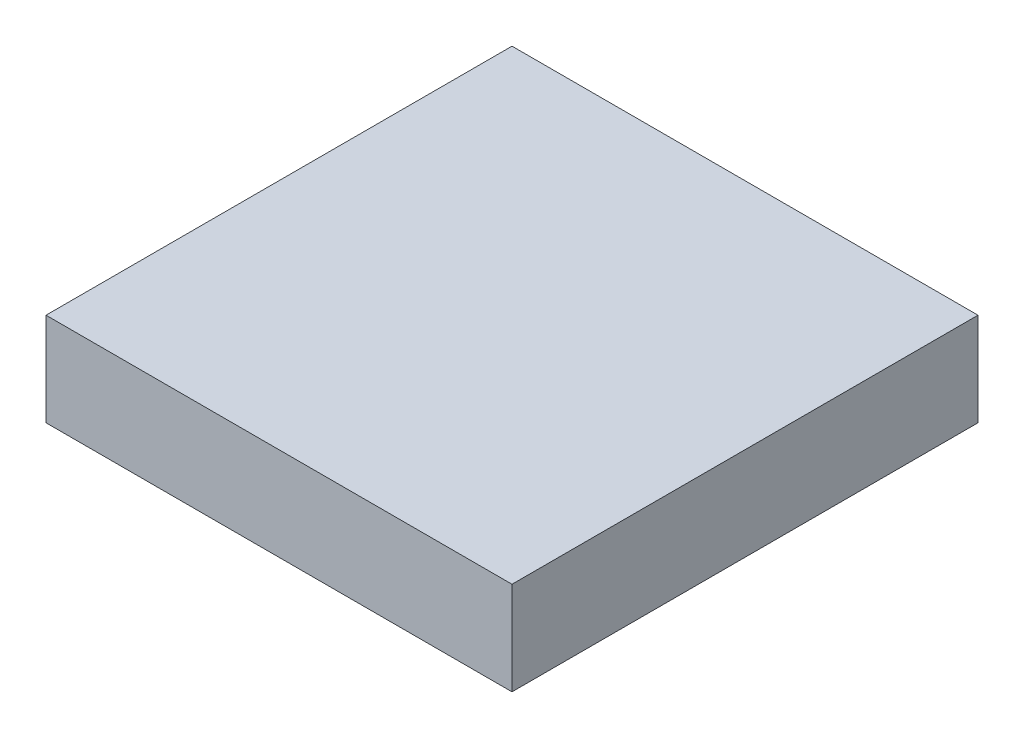
ISO-10303-21;
HEADER;
FILE_DESCRIPTION(('STEP AP214'),'2;1');
FILE_NAME('part.step','',(''),(''),'','','');
FILE_SCHEMA(('AUTOMOTIVE_DESIGN { 1 0 10303 214 1 1 1 1 }'));
ENDSEC;
DATA;
#1=APPLICATION_CONTEXT('core data for automotive mechanical design processes');
#2=APPLICATION_PROTOCOL_DEFINITION('international standard','automotive_design',2000,#1);
#3=PRODUCT_CONTEXT('',#1,'mechanical');
#4=PRODUCT('Part','Part','',(#3));
#5=PRODUCT_RELATED_PRODUCT_CATEGORY('part','',(#4));
#6=PRODUCT_DEFINITION_FORMATION('','',#4);
#7=PRODUCT_DEFINITION_CONTEXT('part definition',#1,'design');
#8=PRODUCT_DEFINITION('design','',#6,#7);
#9=PRODUCT_DEFINITION_SHAPE('','',#8);
#10=(LENGTH_UNIT() NAMED_UNIT(*) SI_UNIT(.MILLI.,.METRE.));
#11=(NAMED_UNIT(*) PLANE_ANGLE_UNIT() SI_UNIT($,.RADIAN.));
#12=(NAMED_UNIT(*) SI_UNIT($,.STERADIAN.) SOLID_ANGLE_UNIT());
#13=UNCERTAINTY_MEASURE_WITH_UNIT(LENGTH_MEASURE(1.E-05),#10,'distance_accuracy_value','');
#14=(GEOMETRIC_REPRESENTATION_CONTEXT(3) GLOBAL_UNCERTAINTY_ASSIGNED_CONTEXT((#13)) GLOBAL_UNIT_ASSIGNED_CONTEXT((#10,
#11,#12)) REPRESENTATION_CONTEXT('',''));
#15=CARTESIAN_POINT('',(0.,0.,0.));
#16=DIRECTION('',(0.,0.,1.));
#17=DIRECTION('',(1.,0.,0.));
#18=AXIS2_PLACEMENT_3D('',#15,#16,#17);
#19=CARTESIAN_POINT('',(-5.,2.,5.));
#20=DIRECTION('',(1.,0.,0.));
#21=DIRECTION('',(0.,0.,-1.));
#22=AXIS2_PLACEMENT_3D('',#19,#20,#21);
#23=PLANE('',#22);
#24=DIRECTION('',(0.,0.,1.));
#25=VECTOR('',#24,1.);
#26=CARTESIAN_POINT('',(-5.,0.,5.));
#27=LINE('',#26,#25);
#28=CARTESIAN_POINT('',(-5.,0.,-5.));
#29=VERTEX_POINT('',#28);
#30=CARTESIAN_POINT('',(-5.,0.,5.));
#31=VERTEX_POINT('',#30);
#32=EDGE_CURVE('E96',#29,#31,#27,.T.);
#33=ORIENTED_EDGE('',*,*,#32,.T.);
#34=DIRECTION('',(0.,-1.,0.));
#35=VECTOR('',#34,1.);
#36=CARTESIAN_POINT('',(-5.,2.,5.));
#37=LINE('',#36,#35);
#38=CARTESIAN_POINT('',(-5.,2.,5.));
#39=VERTEX_POINT('',#38);
#40=EDGE_CURVE('E11',#39,#31,#37,.T.);
#41=ORIENTED_EDGE('',*,*,#40,.F.);
#42=DIRECTION('',(0.,0.,1.));
#43=VECTOR('',#42,1.);
#44=CARTESIAN_POINT('',(-5.,2.,5.));
#45=LINE('',#44,#43);
#46=CARTESIAN_POINT('',(-5.,2.,-5.));
#47=VERTEX_POINT('',#46);
#48=EDGE_CURVE('E84',#47,#39,#45,.T.);
#49=ORIENTED_EDGE('',*,*,#48,.F.);
#50=DIRECTION('',(0.,-1.,0.));
#51=VECTOR('',#50,1.);
#52=CARTESIAN_POINT('',(-5.,2.,-5.));
#53=LINE('',#52,#51);
#54=EDGE_CURVE('E92',#47,#29,#53,.T.);
#55=ORIENTED_EDGE('',*,*,#54,.T.);
#56=EDGE_LOOP('',(#33,#41,#49,#55));
#57=FACE_BOUND('',#56,.T.);
#58=ADVANCED_FACE('F33',(#57),#23,.F.);
#59=CARTESIAN_POINT('',(5.,2.,5.));
#60=DIRECTION('',(0.,0.,-1.));
#61=DIRECTION('',(-1.,0.,0.));
#62=AXIS2_PLACEMENT_3D('',#59,#60,#61);
#63=PLANE('',#62);
#64=DIRECTION('',(1.,0.,0.));
#65=VECTOR('',#64,1.);
#66=CARTESIAN_POINT('',(5.,0.,5.));
#67=LINE('',#66,#65);
#68=CARTESIAN_POINT('',(5.,0.,5.));
#69=VERTEX_POINT('',#68);
#70=EDGE_CURVE('E88',#31,#69,#67,.T.);
#71=ORIENTED_EDGE('',*,*,#70,.T.);
#72=DIRECTION('',(0.,-1.,0.));
#73=VECTOR('',#72,1.);
#74=CARTESIAN_POINT('',(5.,2.,5.));
#75=LINE('',#74,#73);
#76=CARTESIAN_POINT('',(5.,2.,5.));
#77=VERTEX_POINT('',#76);
#78=EDGE_CURVE('E41',#77,#69,#75,.T.);
#79=ORIENTED_EDGE('',*,*,#78,.F.);
#80=DIRECTION('',(1.,0.,0.));
#81=VECTOR('',#80,1.);
#82=CARTESIAN_POINT('',(5.,2.,5.));
#83=LINE('',#82,#81);
#84=EDGE_CURVE('E79',#39,#77,#83,.T.);
#85=ORIENTED_EDGE('',*,*,#84,.F.);
#86=ORIENTED_EDGE('',*,*,#40,.T.);
#87=EDGE_LOOP('',(#71,#79,#85,#86));
#88=FACE_BOUND('',#87,.T.);
#89=ADVANCED_FACE('F87',(#88),#63,.F.);
#90=CARTESIAN_POINT('',(5.,2.,5.));
#91=DIRECTION('',(-1.,0.,0.));
#92=DIRECTION('',(0.,0.,1.));
#93=AXIS2_PLACEMENT_3D('',#90,#91,#92);
#94=PLANE('',#93);
#95=DIRECTION('',(0.,0.,-1.));
#96=VECTOR('',#95,1.);
#97=CARTESIAN_POINT('',(5.,0.,5.));
#98=LINE('',#97,#96);
#99=CARTESIAN_POINT('',(5.,0.,-5.));
#100=VERTEX_POINT('',#99);
#101=EDGE_CURVE('E66',#69,#100,#98,.T.);
#102=ORIENTED_EDGE('',*,*,#101,.T.);
#103=DIRECTION('',(0.,-1.,0.));
#104=VECTOR('',#103,1.);
#105=CARTESIAN_POINT('',(5.,2.,-5.));
#106=LINE('',#105,#104);
#107=CARTESIAN_POINT('',(5.,2.,-5.));
#108=VERTEX_POINT('',#107);
#109=EDGE_CURVE('E89',#108,#100,#106,.T.);
#110=ORIENTED_EDGE('',*,*,#109,.F.);
#111=DIRECTION('',(0.,0.,-1.));
#112=VECTOR('',#111,1.);
#113=CARTESIAN_POINT('',(5.,2.,5.));
#114=LINE('',#113,#112);
#115=EDGE_CURVE('E82',#77,#108,#114,.T.);
#116=ORIENTED_EDGE('',*,*,#115,.F.);
#117=ORIENTED_EDGE('',*,*,#78,.T.);
#118=EDGE_LOOP('',(#102,#110,#116,#117));
#119=FACE_BOUND('',#118,.T.);
#120=ADVANCED_FACE('F90',(#119),#94,.F.);
#121=CARTESIAN_POINT('',(5.,2.,-5.));
#122=DIRECTION('',(0.,0.,1.));
#123=DIRECTION('',(1.,0.,0.));
#124=AXIS2_PLACEMENT_3D('',#121,#122,#123);
#125=PLANE('',#124);
#126=DIRECTION('',(-1.,0.,0.));
#127=VECTOR('',#126,1.);
#128=CARTESIAN_POINT('',(5.,0.,-5.));
#129=LINE('',#128,#127);
#130=EDGE_CURVE('E72',#100,#29,#129,.T.);
#131=ORIENTED_EDGE('',*,*,#130,.T.);
#132=ORIENTED_EDGE('',*,*,#54,.F.);
#133=DIRECTION('',(-1.,0.,0.));
#134=VECTOR('',#133,1.);
#135=CARTESIAN_POINT('',(5.,2.,-5.));
#136=LINE('',#135,#134);
#137=EDGE_CURVE('E49',#108,#47,#136,.T.);
#138=ORIENTED_EDGE('',*,*,#137,.F.);
#139=ORIENTED_EDGE('',*,*,#109,.T.);
#140=EDGE_LOOP('',(#131,#132,#138,#139));
#141=FACE_BOUND('',#140,.T.);
#142=ADVANCED_FACE('F103',(#141),#125,.F.);
#143=CARTESIAN_POINT('',(0.,2.,0.));
#144=DIRECTION('',(0.,1.,0.));
#145=DIRECTION('',(0.,0.,1.));
#146=AXIS2_PLACEMENT_3D('',#143,#144,#145);
#147=PLANE('',#146);
#148=ORIENTED_EDGE('',*,*,#48,.T.);
#149=ORIENTED_EDGE('',*,*,#84,.T.);
#150=ORIENTED_EDGE('',*,*,#115,.T.);
#151=ORIENTED_EDGE('',*,*,#137,.T.);
#152=EDGE_LOOP('',(#148,#149,#150,#151));
#153=FACE_BOUND('',#152,.T.);
#154=ADVANCED_FACE('F80',(#153),#147,.T.);
#155=CARTESIAN_POINT('',(0.,0.,0.));
#156=DIRECTION('',(0.,1.,0.));
#157=DIRECTION('',(0.,0.,1.));
#158=AXIS2_PLACEMENT_3D('',#155,#156,#157);
#159=PLANE('',#158);
#160=ORIENTED_EDGE('',*,*,#32,.F.);
#161=ORIENTED_EDGE('',*,*,#130,.F.);
#162=ORIENTED_EDGE('',*,*,#101,.F.);
#163=ORIENTED_EDGE('',*,*,#70,.F.);
#164=EDGE_LOOP('',(#160,#161,#162,#163));
#165=FACE_BOUND('',#164,.T.);
#166=ADVANCED_FACE('F106',(#165),#159,.F.);
#167=CLOSED_SHELL('',(#58,#89,#120,#142,#154,#166));
#168=MANIFOLD_SOLID_BREP('B2',#167);
#169=ADVANCED_BREP_SHAPE_REPRESENTATION('',(#18,#168),#14);
#170=SHAPE_DEFINITION_REPRESENTATION(#9,#169);
ENDSEC;
END-ISO-10303-21;
